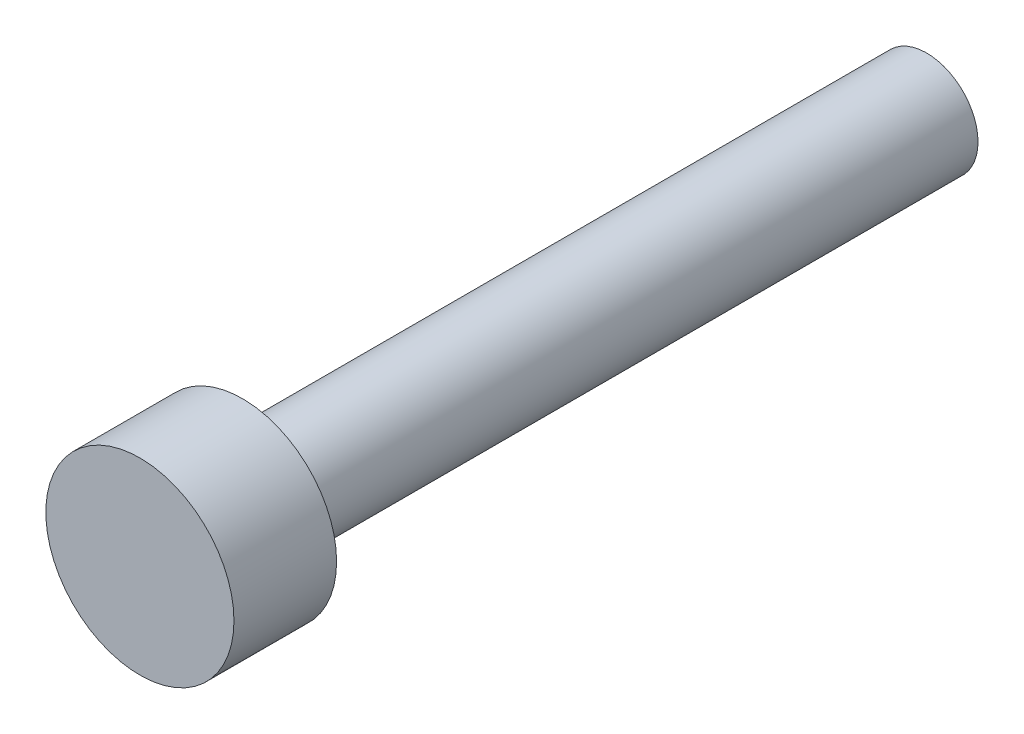
ISO-10303-21;
HEADER;
FILE_DESCRIPTION(('STEP AP214'),'2;1');
FILE_NAME('part.step','',(''),(''),'','','');
FILE_SCHEMA(('AUTOMOTIVE_DESIGN { 1 0 10303 214 1 1 1 1 }'));
ENDSEC;
DATA;
#1=APPLICATION_CONTEXT('core data for automotive mechanical design processes');
#2=APPLICATION_PROTOCOL_DEFINITION('international standard','automotive_design',2000,#1);
#3=PRODUCT_CONTEXT('',#1,'mechanical');
#4=PRODUCT('Part','Part','',(#3));
#5=PRODUCT_RELATED_PRODUCT_CATEGORY('part','',(#4));
#6=PRODUCT_DEFINITION_FORMATION('','',#4);
#7=PRODUCT_DEFINITION_CONTEXT('part definition',#1,'design');
#8=PRODUCT_DEFINITION('design','',#6,#7);
#9=PRODUCT_DEFINITION_SHAPE('','',#8);
#10=(LENGTH_UNIT() NAMED_UNIT(*) SI_UNIT(.MILLI.,.METRE.));
#11=(NAMED_UNIT(*) PLANE_ANGLE_UNIT() SI_UNIT($,.RADIAN.));
#12=(NAMED_UNIT(*) SI_UNIT($,.STERADIAN.) SOLID_ANGLE_UNIT());
#13=UNCERTAINTY_MEASURE_WITH_UNIT(LENGTH_MEASURE(1.E-05),#10,'distance_accuracy_value','');
#14=(GEOMETRIC_REPRESENTATION_CONTEXT(3) GLOBAL_UNCERTAINTY_ASSIGNED_CONTEXT((#13)) GLOBAL_UNIT_ASSIGNED_CONTEXT((#10,
#11,#12)) REPRESENTATION_CONTEXT('',''));
#15=CARTESIAN_POINT('',(0.,0.,0.));
#16=DIRECTION('',(0.,0.,1.));
#17=DIRECTION('',(1.,0.,0.));
#18=AXIS2_PLACEMENT_3D('',#15,#16,#17);
#19=CARTESIAN_POINT('',(0.,0.,0.));
#20=DIRECTION('',(0.,0.,-1.));
#21=DIRECTION('',(-1.,0.,0.));
#22=AXIS2_PLACEMENT_3D('',#19,#20,#21);
#23=CYLINDRICAL_SURFACE('',#22,1.5);
#24=CARTESIAN_POINT('',(0.,0.,0.));
#25=DIRECTION('',(0.,0.,1.));
#26=DIRECTION('',(1.,0.,0.));
#27=AXIS2_PLACEMENT_3D('',#24,#25,#26);
#28=CIRCLE('',#27,1.5);
#29=CARTESIAN_POINT('',(1.5,0.,0.));
#30=VERTEX_POINT('',#29);
#31=EDGE_CURVE('E10',#30,#30,#28,.T.);
#32=ORIENTED_EDGE('',*,*,#31,.F.);
#33=EDGE_LOOP('',(#32));
#34=FACE_BOUND('',#33,.T.);
#35=CARTESIAN_POINT('',(0.,0.,-20.));
#36=DIRECTION('',(0.,0.,1.));
#37=DIRECTION('',(1.,0.,0.));
#38=AXIS2_PLACEMENT_3D('',#35,#36,#37);
#39=CIRCLE('',#38,1.5);
#40=CARTESIAN_POINT('',(1.5,0.,-20.));
#41=VERTEX_POINT('',#40);
#42=EDGE_CURVE('E42',#41,#41,#39,.T.);
#43=ORIENTED_EDGE('',*,*,#42,.T.);
#44=EDGE_LOOP('',(#43));
#45=FACE_BOUND('',#44,.T.);
#46=ADVANCED_FACE('F41',(#34,#45),#23,.T.);
#47=CARTESIAN_POINT('',(0.,0.,-20.));
#48=DIRECTION('',(0.,0.,1.));
#49=DIRECTION('',(1.,0.,0.));
#50=AXIS2_PLACEMENT_3D('',#47,#48,#49);
#51=PLANE('',#50);
#52=ORIENTED_EDGE('',*,*,#42,.F.);
#53=EDGE_LOOP('',(#52));
#54=FACE_BOUND('',#53,.T.);
#55=ADVANCED_FACE('F62',(#54),#51,.F.);
#56=CARTESIAN_POINT('',(0.,0.,3.));
#57=DIRECTION('',(0.,0.,-1.));
#58=DIRECTION('',(-1.,0.,0.));
#59=AXIS2_PLACEMENT_3D('',#56,#57,#58);
#60=CYLINDRICAL_SURFACE('',#59,2.75);
#61=CARTESIAN_POINT('',(0.,0.,3.));
#62=DIRECTION('',(0.,0.,1.));
#63=DIRECTION('',(1.,0.,0.));
#64=AXIS2_PLACEMENT_3D('',#61,#62,#63);
#65=CIRCLE('',#64,2.75);
#66=CARTESIAN_POINT('',(2.75,0.,3.));
#67=VERTEX_POINT('',#66);
#68=EDGE_CURVE('E51',#67,#67,#65,.T.);
#69=ORIENTED_EDGE('',*,*,#68,.F.);
#70=EDGE_LOOP('',(#69));
#71=FACE_BOUND('',#70,.T.);
#72=CARTESIAN_POINT('',(0.,0.,0.));
#73=DIRECTION('',(0.,0.,1.));
#74=DIRECTION('',(1.,0.,0.));
#75=AXIS2_PLACEMENT_3D('',#72,#73,#74);
#76=CIRCLE('',#75,2.75);
#77=CARTESIAN_POINT('',(2.75,0.,0.));
#78=VERTEX_POINT('',#77);
#79=EDGE_CURVE('E52',#78,#78,#76,.T.);
#80=ORIENTED_EDGE('',*,*,#79,.T.);
#81=EDGE_LOOP('',(#80));
#82=FACE_BOUND('',#81,.T.);
#83=ADVANCED_FACE('F63',(#71,#82),#60,.T.);
#84=CARTESIAN_POINT('',(0.,0.,3.));
#85=DIRECTION('',(0.,0.,1.));
#86=DIRECTION('',(1.,0.,0.));
#87=AXIS2_PLACEMENT_3D('',#84,#85,#86);
#88=PLANE('',#87);
#89=ORIENTED_EDGE('',*,*,#68,.T.);
#90=EDGE_LOOP('',(#89));
#91=FACE_BOUND('',#90,.T.);
#92=ADVANCED_FACE('F56',(#91),#88,.T.);
#93=CARTESIAN_POINT('',(0.,0.,0.));
#94=DIRECTION('',(0.,0.,1.));
#95=DIRECTION('',(1.,0.,0.));
#96=AXIS2_PLACEMENT_3D('',#93,#94,#95);
#97=PLANE('',#96);
#98=ORIENTED_EDGE('',*,*,#31,.T.);
#99=EDGE_LOOP('',(#98));
#100=FACE_BOUND('',#99,.T.);
#101=ORIENTED_EDGE('',*,*,#79,.F.);
#102=EDGE_LOOP('',(#101));
#103=FACE_BOUND('',#102,.T.);
#104=ADVANCED_FACE('F66',(#100,#103),#97,.F.);
#105=CLOSED_SHELL('',(#46,#55,#83,#92,#104));
#106=MANIFOLD_SOLID_BREP('B2',#105);
#107=ADVANCED_BREP_SHAPE_REPRESENTATION('',(#18,#106),#14);
#108=SHAPE_DEFINITION_REPRESENTATION(#9,#107);
ENDSEC;
END-ISO-10303-21;
